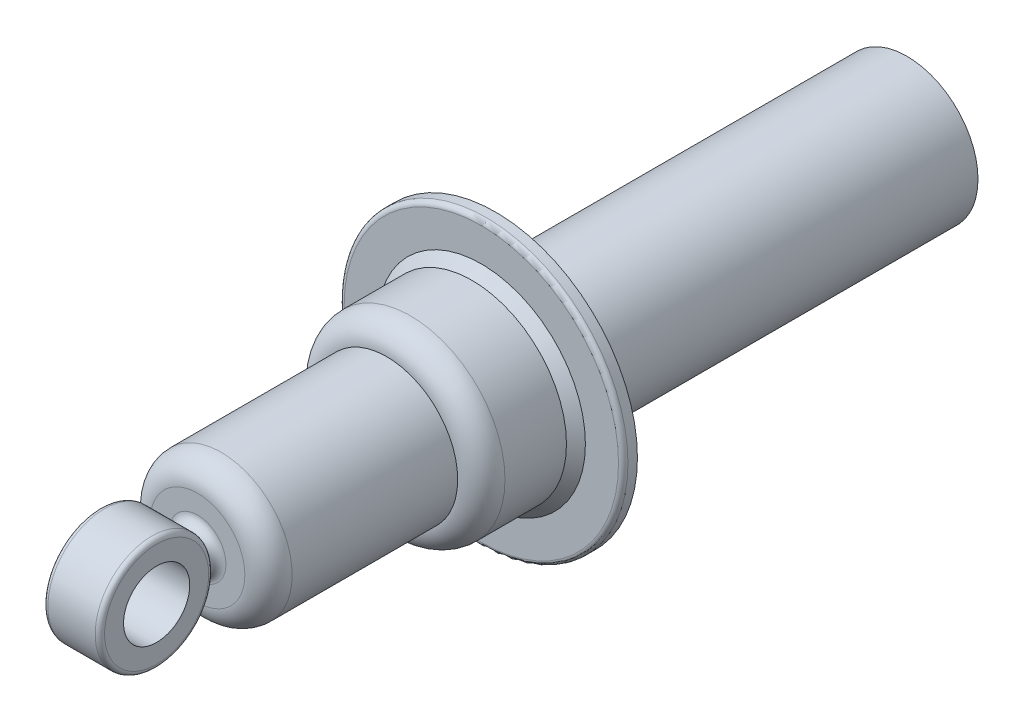
ISO-10303-21;
HEADER;
FILE_DESCRIPTION(('STEP AP214'),'2;1');
FILE_NAME('part.step','',(''),(''),'','','');
FILE_SCHEMA(('AUTOMOTIVE_DESIGN { 1 0 10303 214 1 1 1 1 }'));
ENDSEC;
DATA;
#1=APPLICATION_CONTEXT('core data for automotive mechanical design processes');
#2=APPLICATION_PROTOCOL_DEFINITION('international standard','automotive_design',2000,#1);
#3=PRODUCT_CONTEXT('',#1,'mechanical');
#4=PRODUCT('Part','Part','',(#3));
#5=PRODUCT_RELATED_PRODUCT_CATEGORY('part','',(#4));
#6=PRODUCT_DEFINITION_FORMATION('','',#4);
#7=PRODUCT_DEFINITION_CONTEXT('part definition',#1,'design');
#8=PRODUCT_DEFINITION('design','',#6,#7);
#9=PRODUCT_DEFINITION_SHAPE('','',#8);
#10=(LENGTH_UNIT() NAMED_UNIT(*) SI_UNIT(.MILLI.,.METRE.));
#11=(NAMED_UNIT(*) PLANE_ANGLE_UNIT() SI_UNIT($,.RADIAN.));
#12=(NAMED_UNIT(*) SI_UNIT($,.STERADIAN.) SOLID_ANGLE_UNIT());
#13=UNCERTAINTY_MEASURE_WITH_UNIT(LENGTH_MEASURE(1.E-05),#10,'distance_accuracy_value','');
#14=(GEOMETRIC_REPRESENTATION_CONTEXT(3) GLOBAL_UNCERTAINTY_ASSIGNED_CONTEXT((#13)) GLOBAL_UNIT_ASSIGNED_CONTEXT((#10,
#11,#12)) REPRESENTATION_CONTEXT('',''));
#15=CARTESIAN_POINT('',(0.,0.,0.));
#16=DIRECTION('',(0.,0.,1.));
#17=DIRECTION('',(1.,0.,0.));
#18=AXIS2_PLACEMENT_3D('',#15,#16,#17);
#19=CARTESIAN_POINT('',(0.,0.,65.));
#20=DIRECTION('',(0.,0.,-1.));
#21=DIRECTION('',(-1.,0.,0.));
#22=AXIS2_PLACEMENT_3D('',#19,#20,#21);
#23=TOROIDAL_SURFACE('',#22,5.99999999999999,2.);
#24=CARTESIAN_POINT('',(0.,0.,63.));
#25=DIRECTION('',(0.,0.,-1.));
#26=DIRECTION('',(-1.,0.,0.));
#27=AXIS2_PLACEMENT_3D('',#24,#25,#26);
#28=CIRCLE('',#27,5.99999999999999);
#29=CARTESIAN_POINT('',(-5.99999999999999,0.,63.));
#30=VERTEX_POINT('',#29);
#31=EDGE_CURVE('E121',#30,#30,#28,.T.);
#32=ORIENTED_EDGE('',*,*,#31,.F.);
#33=EDGE_LOOP('',(#32));
#34=FACE_BOUND('',#33,.T.);
#35=CARTESIAN_POINT('',(0.,5.14285714285714,66.8070158058105));
#36=CARTESIAN_POINT('',(-0.00683111749316836,5.14052435807147,66.805909291334));
#37=CARTESIAN_POINT('',(-0.0136583637472127,5.13818142762407,66.8047988631423));
#38=CARTESIAN_POINT('',(-0.335580244607104,5.02716482712665,66.7522261730362));
#39=CARTESIAN_POINT('',(-0.642346757596547,4.89688351274686,66.6924861731287));
#40=CARTESIAN_POINT('',(-1.23309973830504,4.59429567252348,66.562198238867));
#41=CARTESIAN_POINT('',(-1.51701026877825,4.42185616688219,66.4916163730774));
#42=CARTESIAN_POINT('',(-1.94131291127168,4.11739258260878,66.3769640915493));
#43=CARTESIAN_POINT('',(-2.09186159732641,3.99885559590663,66.3342230827088));
#44=CARTESIAN_POINT('',(-2.38136346941427,3.74821800163414,66.2487422970124));
#45=CARTESIAN_POINT('',(-2.52031365968215,3.61611390935864,66.2060025233077));
#46=CARTESIAN_POINT('',(-2.78460190632993,3.3389830329185,66.1220941042128));
#47=CARTESIAN_POINT('',(-2.90996689634401,3.19398289585244,66.0809224590997));
#48=CARTESIAN_POINT('',(-3.1454819914294,2.89137923099843,66.001606546956));
#49=CARTESIAN_POINT('',(-3.25564007915424,2.73378238481407,65.9634606960847));
#50=CARTESIAN_POINT('',(-3.42718546012719,2.45756807824615,65.9028899676523));
#51=CARTESIAN_POINT('',(-3.49310583113304,2.34201109156401,65.8792572731865));
#52=CARTESIAN_POINT('',(-3.61599679192408,2.10574311990463,65.8347005581334));
#53=CARTESIAN_POINT('',(-3.67296969680856,1.98503347845819,65.8137758371229));
#54=CARTESIAN_POINT('',(-3.77721359009538,1.73908739180227,65.7751450801437));
#55=CARTESIAN_POINT('',(-3.82449127345421,1.61385414109681,65.7574368240434));
#56=CARTESIAN_POINT('',(-3.90870796253837,1.35948901093591,65.7256793662031));
#57=CARTESIAN_POINT('',(-3.94564664839743,1.23035701099849,65.7116302776709));
#58=CARTESIAN_POINT('',(-4.00876295327995,0.968306734991215,65.68751407007));
#59=CARTESIAN_POINT('',(-4.03487629792438,0.835370716638148,65.6774707478041));
#60=CARTESIAN_POINT('',(-4.07555634614535,0.567479843073603,65.6617853992306));
#61=CARTESIAN_POINT('',(-4.09012309122624,0.432524995120603,65.6561433571024));
#62=CARTESIAN_POINT('',(-4.10742931860576,0.161768821752286,65.6494370762688));
#63=CARTESIAN_POINT('',(-4.11017101728493,0.0259676597414328,65.6483719797019));
#64=CARTESIAN_POINT('',(-4.10377818667589,-0.245306389126214,65.6508516033618));
#65=CARTESIAN_POINT('',(-4.09464442787565,-0.380779296709066,65.6543960245198));
#66=CARTESIAN_POINT('',(-4.06605733309157,-0.637867111882039,65.665449368171));
#67=CARTESIAN_POINT('',(-4.04762622916664,-0.759614424849702,65.6725652790017));
#68=CARTESIAN_POINT('',(-4.00139374245719,-1.00109431803442,65.6903284565602));
#69=CARTESIAN_POINT('',(-3.97358921197831,-1.12082620725147,65.7009769095334));
#70=CARTESIAN_POINT('',(-3.9090226888023,-1.35745605921806,65.7255431962847));
#71=CARTESIAN_POINT('',(-3.87226358280308,-1.47435492192782,65.7394599763961));
#72=CARTESIAN_POINT('',(-3.7902539750548,-1.70477418810088,65.7702527744251));
#73=CARTESIAN_POINT('',(-3.74500018414043,-1.81829326310815,65.7871299384448));
#74=CARTESIAN_POINT('',(-3.64434397228495,-2.04637324998585,65.8242937976025));
#75=CARTESIAN_POINT('',(-3.58857888275854,-2.1607547358651,65.8446990041176));
#76=CARTESIAN_POINT('',(-3.46899916652083,-2.3847763978155,65.8879086267375));
#77=CARTESIAN_POINT('',(-3.40518168474838,-2.49441487359546,65.9107138933307));
#78=CARTESIAN_POINT('',(-3.20256959341564,-2.81568020886131,65.9820622227178));
#79=CARTESIAN_POINT('',(-3.0525939488692,-3.01970462282766,66.0335458873936));
#80=CARTESIAN_POINT('',(-2.70005980014282,-3.43815477599845,66.1498048164816));
#81=CARTESIAN_POINT('',(-2.49289656376903,-3.64845457002569,66.2153519274315));
#82=CARTESIAN_POINT('',(-2.05090817454218,-4.0370429062682,66.3467059014859));
#83=CARTESIAN_POINT('',(-1.81609111881404,-4.21534078034215,66.4125126831306));
#84=CARTESIAN_POINT('',(-1.29226394743762,-4.56016048480734,66.5476001772651));
#85=CARTESIAN_POINT('',(-1.00016329566901,-4.72226416837034,66.6162498003024));
#86=CARTESIAN_POINT('',(-0.529404951856543,-4.94094752577036,66.7131948988371));
#87=CARTESIAN_POINT('',(-0.358329743011136,-5.01232606956655,66.745822226922));
#88=CARTESIAN_POINT('',(-0.130030889785519,-5.0973059289165,66.7855030702966));
#89=CARTESIAN_POINT('',(-0.0753885520475893,-5.11689340638941,66.7947179468762));
#90=CARTESIAN_POINT('',(-0.0136585437799461,-5.13818136715376,66.8047988126902));
#91=CARTESIAN_POINT('',(-0.00683129991441208,-5.14052429758992,66.8059092399263));
#92=CARTESIAN_POINT('',(0.,-5.14285714285714,66.8070158058105));
#93=B_SPLINE_CURVE_WITH_KNOTS('',3,(#35,#36,#37,#38,#39,#40,#41,#42,#43,#44,#45,#46,#47,#48,#49,
#50,#51,#52,#53,#54,#55,#56,#57,#58,#59,#60,#61,#62,#63,#64,#65,#66,#67,#68,#69,#70,#71,#72,#73,
#74,#75,#76,#77,#78,#79,#80,#81,#82,#83,#84,#85,#86,#87,#88,#89,#90,#91,#92),.UNSPECIFIED.,.F.,
.F.,(4,2,2,2,2,2,2,2,2,2,2,2,2,2,2,2,2,2,2,2,2,2,2,2,2,2,2,2,4),(0.,0.0219089296133557,
1.03365282671899,2.0486302074452,2.6368971074862,3.22531548331455,3.8125450693439,
4.39946521549095,4.80444984654547,5.20932951717326,5.61392865291026,6.01854030468785,
6.42552103130609,6.83250029502191,7.23940327488175,7.64627985590948,8.01587563708157,
8.38559565620808,8.75519664558258,9.12494104178366,9.51117946937058,9.89755522874494,
10.6701497290384,11.5740573165163,12.4777008919959,13.4968467830785,14.0609376622446,
14.2372416685142,14.2591505981276),.UNSPECIFIED.);
#94=CARTESIAN_POINT('',(0.,5.14285714285714,66.8070158058105));
#95=VERTEX_POINT('',#94);
#96=CARTESIAN_POINT('',(0.,-5.14285714285714,66.8070158058105));
#97=VERTEX_POINT('',#96);
#98=EDGE_CURVE('E64',#95,#97,#93,.T.);
#99=ORIENTED_EDGE('',*,*,#98,.F.);
#100=CARTESIAN_POINT('',(0.,-5.14285714285714,66.8070158058105));
#101=CARTESIAN_POINT('',(0.00683111749316836,-5.14052435807147,66.805909291334));
#102=CARTESIAN_POINT('',(0.0136583637472127,-5.13818142762407,66.8047988631423));
#103=CARTESIAN_POINT('',(0.335580244607104,-5.02716482712665,66.7522261730362));
#104=CARTESIAN_POINT('',(0.642346757596547,-4.89688351274686,66.6924861731287));
#105=CARTESIAN_POINT('',(1.23309973830504,-4.59429567252348,66.562198238867));
#106=CARTESIAN_POINT('',(1.51701026877825,-4.42185616688219,66.4916163730774));
#107=CARTESIAN_POINT('',(1.94131291127168,-4.11739258260878,66.3769640915493));
#108=CARTESIAN_POINT('',(2.09186159732641,-3.99885559590663,66.3342230827088));
#109=CARTESIAN_POINT('',(2.38136346941427,-3.74821800163414,66.2487422970124));
#110=CARTESIAN_POINT('',(2.52031365968215,-3.61611390935864,66.2060025233077));
#111=CARTESIAN_POINT('',(2.78460190632993,-3.3389830329185,66.1220941042128));
#112=CARTESIAN_POINT('',(2.90996689634401,-3.19398289585244,66.0809224590997));
#113=CARTESIAN_POINT('',(3.1454819914294,-2.89137923099843,66.001606546956));
#114=CARTESIAN_POINT('',(3.25564007915424,-2.73378238481407,65.9634606960847));
#115=CARTESIAN_POINT('',(3.42718546012719,-2.45756807824615,65.9028899676523));
#116=CARTESIAN_POINT('',(3.49310583113304,-2.34201109156401,65.8792572731865));
#117=CARTESIAN_POINT('',(3.61599679192408,-2.10574311990463,65.8347005581334));
#118=CARTESIAN_POINT('',(3.67296969680856,-1.98503347845819,65.8137758371229));
#119=CARTESIAN_POINT('',(3.77721359009538,-1.73908739180227,65.7751450801437));
#120=CARTESIAN_POINT('',(3.82449127345421,-1.61385414109681,65.7574368240434));
#121=CARTESIAN_POINT('',(3.90870796253837,-1.35948901093591,65.7256793662031));
#122=CARTESIAN_POINT('',(3.94564664839743,-1.23035701099849,65.7116302776709));
#123=CARTESIAN_POINT('',(4.00876295327995,-0.968306734991215,65.68751407007));
#124=CARTESIAN_POINT('',(4.03487629792438,-0.835370716638148,65.6774707478041));
#125=CARTESIAN_POINT('',(4.07555634614535,-0.567479843073603,65.6617853992306));
#126=CARTESIAN_POINT('',(4.09012309122624,-0.432524995120603,65.6561433571024));
#127=CARTESIAN_POINT('',(4.10742931860576,-0.161768821752286,65.6494370762688));
#128=CARTESIAN_POINT('',(4.11017101728493,-0.0259676597414328,65.6483719797019));
#129=CARTESIAN_POINT('',(4.10377818667589,0.245306389126214,65.6508516033618));
#130=CARTESIAN_POINT('',(4.09464442787565,0.380779296709066,65.6543960245198));
#131=CARTESIAN_POINT('',(4.06605733309157,0.637867111882039,65.665449368171));
#132=CARTESIAN_POINT('',(4.04762622916664,0.759614424849702,65.6725652790017));
#133=CARTESIAN_POINT('',(4.00139374245719,1.00109431803442,65.6903284565602));
#134=CARTESIAN_POINT('',(3.97358921197831,1.12082620725147,65.7009769095334));
#135=CARTESIAN_POINT('',(3.9090226888023,1.35745605921806,65.7255431962847));
#136=CARTESIAN_POINT('',(3.87226358280308,1.47435492192782,65.7394599763961));
#137=CARTESIAN_POINT('',(3.7902539750548,1.70477418810088,65.7702527744251));
#138=CARTESIAN_POINT('',(3.74500018414043,1.81829326310815,65.7871299384448));
#139=CARTESIAN_POINT('',(3.64434397228495,2.04637324998585,65.8242937976025));
#140=CARTESIAN_POINT('',(3.58857888275854,2.1607547358651,65.8446990041176));
#141=CARTESIAN_POINT('',(3.46899916652083,2.3847763978155,65.8879086267375));
#142=CARTESIAN_POINT('',(3.40518168474838,2.49441487359546,65.9107138933307));
#143=CARTESIAN_POINT('',(3.20256959341564,2.81568020886131,65.9820622227178));
#144=CARTESIAN_POINT('',(3.0525939488692,3.01970462282766,66.0335458873936));
#145=CARTESIAN_POINT('',(2.70005980014282,3.43815477599845,66.1498048164816));
#146=CARTESIAN_POINT('',(2.49289656376903,3.64845457002569,66.2153519274315));
#147=CARTESIAN_POINT('',(2.05090817454218,4.0370429062682,66.3467059014859));
#148=CARTESIAN_POINT('',(1.81609111881404,4.21534078034215,66.4125126831306));
#149=CARTESIAN_POINT('',(1.29226394743762,4.56016048480734,66.5476001772651));
#150=CARTESIAN_POINT('',(1.00016329566901,4.72226416837034,66.6162498003024));
#151=CARTESIAN_POINT('',(0.529404951856543,4.94094752577036,66.7131948988371));
#152=CARTESIAN_POINT('',(0.358329743011136,5.01232606956655,66.745822226922));
#153=CARTESIAN_POINT('',(0.130030889785519,5.0973059289165,66.7855030702966));
#154=CARTESIAN_POINT('',(0.0753885520475893,5.11689340638941,66.7947179468762));
#155=CARTESIAN_POINT('',(0.0136585437799461,5.13818136715376,66.8047988126902));
#156=CARTESIAN_POINT('',(0.00683129991441208,5.14052429758992,66.8059092399263));
#157=CARTESIAN_POINT('',(0.,5.14285714285714,66.8070158058105));
#158=B_SPLINE_CURVE_WITH_KNOTS('',3,(#100,#101,#102,#103,#104,#105,#106,#107,#108,#109,#110,
#111,#112,#113,#114,#115,#116,#117,#118,#119,#120,#121,#122,#123,#124,#125,#126,#127,#128,#129,
#130,#131,#132,#133,#134,#135,#136,#137,#138,#139,#140,#141,#142,#143,#144,#145,#146,#147,#148,
#149,#150,#151,#152,#153,#154,#155,#156,#157),.UNSPECIFIED.,.F.,.F.,(4,2,2,2,2,2,2,2,2,2,2,2,2,
2,2,2,2,2,2,2,2,2,2,2,2,2,2,2,4),(0.,0.0219089296133557,1.03365282671899,2.0486302074452,
2.6368971074862,3.22531548331455,3.8125450693439,4.39946521549095,4.80444984654547,
5.20932951717326,5.61392865291026,6.01854030468785,6.42552103130609,6.83250029502191,
7.23940327488175,7.64627985590948,8.01587563708157,8.38559565620808,8.75519664558258,
9.12494104178366,9.51117946937058,9.89755522874494,10.6701497290384,11.5740573165163,
12.4777008919959,13.4968467830785,14.0609376622446,14.2372416685142,14.2591505981276),.UNSPECIFIED.);
#159=EDGE_CURVE('E61',#97,#95,#158,.T.);
#160=ORIENTED_EDGE('',*,*,#159,.F.);
#161=EDGE_LOOP('',(#99,#160));
#162=FACE_BOUND('',#161,.T.);
#163=ADVANCED_FACE('F47',(#34,#162),#23,.F.);
#164=CARTESIAN_POINT('',(0.,0.,3.));
#165=DIRECTION('',(0.,0.,-1.));
#166=DIRECTION('',(-1.,0.,0.));
#167=AXIS2_PLACEMENT_3D('',#164,#165,#166);
#168=PLANE('',#167);
#169=CARTESIAN_POINT('',(0.,0.,3.));
#170=DIRECTION('',(0.,0.,1.));
#171=DIRECTION('',(1.,0.,0.));
#172=AXIS2_PLACEMENT_3D('',#169,#170,#171);
#173=CIRCLE('',#172,7.50000000000002);
#174=CARTESIAN_POINT('',(7.50000000000002,0.,3.));
#175=VERTEX_POINT('',#174);
#176=EDGE_CURVE('E150',#175,#175,#173,.T.);
#177=ORIENTED_EDGE('',*,*,#176,.F.);
#178=EDGE_LOOP('',(#177));
#179=FACE_BOUND('',#178,.T.);
#180=ADVANCED_FACE('F109',(#179),#168,.T.);
#181=CARTESIAN_POINT('',(0.,0.,71.7954339583367));
#182=DIRECTION('',(0.,0.,1.));
#183=DIRECTION('',(1.,0.,0.));
#184=AXIS2_PLACEMENT_3D('',#181,#182,#183);
#185=CYLINDRICAL_SURFACE('',#184,7.50000000000002);
#186=CARTESIAN_POINT('',(0.,0.,-86.));
#187=DIRECTION('',(0.,0.,-1.));
#188=DIRECTION('',(-1.,0.,0.));
#189=AXIS2_PLACEMENT_3D('',#186,#187,#188);
#190=CIRCLE('',#189,7.50000000000002);
#191=CARTESIAN_POINT('',(-7.50000000000002,0.,-86.));
#192=VERTEX_POINT('',#191);
#193=EDGE_CURVE('E153',#192,#192,#190,.T.);
#194=ORIENTED_EDGE('',*,*,#193,.T.);
#195=EDGE_LOOP('',(#194));
#196=FACE_BOUND('',#195,.T.);
#197=ORIENTED_EDGE('',*,*,#176,.T.);
#198=EDGE_LOOP('',(#197));
#199=FACE_BOUND('',#198,.T.);
#200=ADVANCED_FACE('F118',(#196,#199),#185,.F.);
#201=CARTESIAN_POINT('',(0.,0.,-87.));
#202=DIRECTION('',(0.,0.,-1.));
#203=DIRECTION('',(-1.,0.,0.));
#204=AXIS2_PLACEMENT_3D('',#201,#202,#203);
#205=PLANE('',#204);
#206=CARTESIAN_POINT('',(0.,0.,-87.));
#207=DIRECTION('',(0.,0.,-1.));
#208=DIRECTION('',(-1.,0.,0.));
#209=AXIS2_PLACEMENT_3D('',#206,#207,#208);
#210=CIRCLE('',#209,8.50000000000002);
#211=CARTESIAN_POINT('',(-8.50000000000002,0.,-87.));
#212=VERTEX_POINT('',#211);
#213=EDGE_CURVE('E147',#212,#212,#210,.F.);
#214=ORIENTED_EDGE('',*,*,#213,.T.);
#215=EDGE_LOOP('',(#214));
#216=FACE_BOUND('',#215,.T.);
#217=CARTESIAN_POINT('',(0.,0.,-87.));
#218=DIRECTION('',(0.,0.,1.));
#219=DIRECTION('',(1.,0.,0.));
#220=AXIS2_PLACEMENT_3D('',#217,#218,#219);
#221=CIRCLE('',#220,15.);
#222=CARTESIAN_POINT('',(15.,0.,-87.));
#223=VERTEX_POINT('',#222);
#224=EDGE_CURVE('E145',#223,#223,#221,.T.);
#225=ORIENTED_EDGE('',*,*,#224,.F.);
#226=EDGE_LOOP('',(#225));
#227=FACE_BOUND('',#226,.T.);
#228=ADVANCED_FACE('F336',(#216,#227),#205,.T.);
#229=CARTESIAN_POINT('',(0.,0.,71.7954339583367));
#230=DIRECTION('',(0.,0.,1.));
#231=DIRECTION('',(1.,0.,0.));
#232=AXIS2_PLACEMENT_3D('',#229,#230,#231);
#233=CYLINDRICAL_SURFACE('',#232,15.);
#234=ORIENTED_EDGE('',*,*,#224,.T.);
#235=EDGE_LOOP('',(#234));
#236=FACE_BOUND('',#235,.T.);
#237=CARTESIAN_POINT('',(0.,0.,-3.));
#238=DIRECTION('',(0.,0.,1.));
#239=DIRECTION('',(1.,0.,0.));
#240=AXIS2_PLACEMENT_3D('',#237,#238,#239);
#241=CIRCLE('',#240,15.);
#242=CARTESIAN_POINT('',(15.,0.,-3.));
#243=VERTEX_POINT('',#242);
#244=EDGE_CURVE('E143',#243,#243,#241,.T.);
#245=ORIENTED_EDGE('',*,*,#244,.F.);
#246=EDGE_LOOP('',(#245));
#247=FACE_BOUND('',#246,.T.);
#248=ADVANCED_FACE('F350',(#236,#247),#233,.T.);
#249=CARTESIAN_POINT('',(0.,0.,-3.));
#250=DIRECTION('',(0.,0.,-1.));
#251=DIRECTION('',(-1.,0.,0.));
#252=AXIS2_PLACEMENT_3D('',#249,#250,#251);
#253=PLANE('',#252);
#254=ORIENTED_EDGE('',*,*,#244,.T.);
#255=EDGE_LOOP('',(#254));
#256=FACE_BOUND('',#255,.T.);
#257=CARTESIAN_POINT('',(0.,0.,-3.));
#258=DIRECTION('',(0.,0.,1.));
#259=DIRECTION('',(1.,0.,0.));
#260=AXIS2_PLACEMENT_3D('',#257,#258,#259);
#261=CIRCLE('',#260,20.);
#262=CARTESIAN_POINT('',(20.,0.,-3.));
#263=VERTEX_POINT('',#262);
#264=EDGE_CURVE('E139',#263,#263,#261,.T.);
#265=ORIENTED_EDGE('',*,*,#264,.F.);
#266=EDGE_LOOP('',(#265));
#267=FACE_BOUND('',#266,.T.);
#268=ADVANCED_FACE('F360',(#256,#267),#253,.T.);
#269=CARTESIAN_POINT('',(0.,0.,71.7954339583367));
#270=DIRECTION('',(0.,0.,1.));
#271=DIRECTION('',(1.,0.,0.));
#272=AXIS2_PLACEMENT_3D('',#269,#270,#271);
#273=CYLINDRICAL_SURFACE('',#272,20.);
#274=CARTESIAN_POINT('',(0.,0.,0.));
#275=DIRECTION('',(0.,0.,1.));
#276=DIRECTION('',(1.,0.,0.));
#277=AXIS2_PLACEMENT_3D('',#274,#275,#276);
#278=CIRCLE('',#277,20.);
#279=CARTESIAN_POINT('',(20.,0.,0.));
#280=VERTEX_POINT('',#279);
#281=EDGE_CURVE('E134',#280,#280,#278,.T.);
#282=ORIENTED_EDGE('',*,*,#281,.F.);
#283=EDGE_LOOP('',(#282));
#284=FACE_BOUND('',#283,.T.);
#285=ORIENTED_EDGE('',*,*,#264,.T.);
#286=EDGE_LOOP('',(#285));
#287=FACE_BOUND('',#286,.T.);
#288=ADVANCED_FACE('F324',(#284,#287),#273,.T.);
#289=CARTESIAN_POINT('',(0.,0.,0.));
#290=DIRECTION('',(0.,0.,-1.));
#291=DIRECTION('',(-1.,0.,0.));
#292=AXIS2_PLACEMENT_3D('',#289,#290,#291);
#293=PLANE('',#292);
#294=ORIENTED_EDGE('',*,*,#281,.T.);
#295=EDGE_LOOP('',(#294));
#296=FACE_BOUND('',#295,.T.);
#297=CARTESIAN_POINT('',(0.,0.,0.));
#298=DIRECTION('',(0.,0.,1.));
#299=DIRECTION('',(1.,0.,0.));
#300=AXIS2_PLACEMENT_3D('',#297,#298,#299);
#301=CIRCLE('',#300,30.);
#302=CARTESIAN_POINT('',(30.,0.,0.));
#303=VERTEX_POINT('',#302);
#304=EDGE_CURVE('E130',#303,#303,#301,.T.);
#305=ORIENTED_EDGE('',*,*,#304,.F.);
#306=EDGE_LOOP('',(#305));
#307=FACE_BOUND('',#306,.T.);
#308=ADVANCED_FACE('F312',(#296,#307),#293,.T.);
#309=CARTESIAN_POINT('',(0.,0.,71.7954339583367));
#310=DIRECTION('',(0.,0.,1.));
#311=DIRECTION('',(1.,0.,0.));
#312=AXIS2_PLACEMENT_3D('',#309,#310,#311);
#313=CYLINDRICAL_SURFACE('',#312,30.);
#314=CARTESIAN_POINT('',(0.,0.,2.));
#315=DIRECTION('',(0.,0.,1.));
#316=DIRECTION('',(1.,0.,0.));
#317=AXIS2_PLACEMENT_3D('',#314,#315,#316);
#318=CIRCLE('',#317,30.);
#319=CARTESIAN_POINT('',(30.,0.,2.));
#320=VERTEX_POINT('',#319);
#321=EDGE_CURVE('E169',#320,#320,#318,.F.);
#322=ORIENTED_EDGE('',*,*,#321,.T.);
#323=EDGE_LOOP('',(#322));
#324=FACE_BOUND('',#323,.T.);
#325=ORIENTED_EDGE('',*,*,#304,.T.);
#326=EDGE_LOOP('',(#325));
#327=FACE_BOUND('',#326,.T.);
#328=ADVANCED_FACE('F308',(#324,#327),#313,.T.);
#329=CARTESIAN_POINT('',(0.,0.,3.00000000000001));
#330=DIRECTION('',(0.,0.,1.));
#331=DIRECTION('',(1.,0.,0.));
#332=AXIS2_PLACEMENT_3D('',#329,#330,#331);
#333=PLANE('',#332);
#334=CARTESIAN_POINT('',(0.,0.,3.00000000000001));
#335=DIRECTION('',(0.,0.,1.));
#336=DIRECTION('',(1.,0.,0.));
#337=AXIS2_PLACEMENT_3D('',#334,#335,#336);
#338=CIRCLE('',#337,22.);
#339=CARTESIAN_POINT('',(22.,0.,3.00000000000001));
#340=VERTEX_POINT('',#339);
#341=EDGE_CURVE('E70',#340,#340,#338,.F.);
#342=ORIENTED_EDGE('',*,*,#341,.T.);
#343=EDGE_LOOP('',(#342));
#344=FACE_BOUND('',#343,.T.);
#345=CARTESIAN_POINT('',(0.,0.,3.00000000000001));
#346=DIRECTION('',(0.,0.,1.));
#347=DIRECTION('',(1.,0.,0.));
#348=AXIS2_PLACEMENT_3D('',#345,#346,#347);
#349=CIRCLE('',#348,29.);
#350=CARTESIAN_POINT('',(29.,0.,3.00000000000001));
#351=VERTEX_POINT('',#350);
#352=EDGE_CURVE('E164',#351,#351,#349,.T.);
#353=ORIENTED_EDGE('',*,*,#352,.T.);
#354=EDGE_LOOP('',(#353));
#355=FACE_BOUND('',#354,.T.);
#356=ADVANCED_FACE('F296',(#344,#355),#333,.T.);
#357=CARTESIAN_POINT('',(0.,0.,71.7954339583367));
#358=DIRECTION('',(0.,0.,1.));
#359=DIRECTION('',(1.,0.,0.));
#360=AXIS2_PLACEMENT_3D('',#357,#358,#359);
#361=CYLINDRICAL_SURFACE('',#360,20.);
#362=CARTESIAN_POINT('',(0.,0.,5.));
#363=DIRECTION('',(0.,0.,1.));
#364=DIRECTION('',(1.,0.,0.));
#365=AXIS2_PLACEMENT_3D('',#362,#363,#364);
#366=CIRCLE('',#365,20.);
#367=CARTESIAN_POINT('',(20.,0.,5.));
#368=VERTEX_POINT('',#367);
#369=EDGE_CURVE('E71',#368,#368,#366,.T.);
#370=ORIENTED_EDGE('',*,*,#369,.T.);
#371=EDGE_LOOP('',(#370));
#372=FACE_BOUND('',#371,.T.);
#373=CARTESIAN_POINT('',(0.,0.,18.));
#374=DIRECTION('',(0.,0.,1.));
#375=DIRECTION('',(1.,0.,0.));
#376=AXIS2_PLACEMENT_3D('',#373,#374,#375);
#377=CIRCLE('',#376,20.);
#378=CARTESIAN_POINT('',(20.,0.,18.));
#379=VERTEX_POINT('',#378);
#380=EDGE_CURVE('E165',#379,#379,#377,.F.);
#381=ORIENTED_EDGE('',*,*,#380,.T.);
#382=EDGE_LOOP('',(#381));
#383=FACE_BOUND('',#382,.T.);
#384=ADVANCED_FACE('F171',(#372,#383),#361,.T.);
#385=CARTESIAN_POINT('',(0.,0.,71.7954339583367));
#386=DIRECTION('',(0.,0.,1.));
#387=DIRECTION('',(1.,0.,0.));
#388=AXIS2_PLACEMENT_3D('',#385,#386,#387);
#389=CYLINDRICAL_SURFACE('',#388,15.);
#390=CARTESIAN_POINT('',(0.,0.,58.));
#391=DIRECTION('',(0.,0.,1.));
#392=DIRECTION('',(1.,0.,0.));
#393=AXIS2_PLACEMENT_3D('',#390,#391,#392);
#394=CIRCLE('',#393,15.);
#395=CARTESIAN_POINT('',(15.,0.,58.));
#396=VERTEX_POINT('',#395);
#397=EDGE_CURVE('E157',#396,#396,#394,.F.);
#398=ORIENTED_EDGE('',*,*,#397,.T.);
#399=EDGE_LOOP('',(#398));
#400=FACE_BOUND('',#399,.T.);
#401=CARTESIAN_POINT('',(0.,0.,23.));
#402=DIRECTION('',(0.,0.,1.));
#403=DIRECTION('',(1.,0.,0.));
#404=AXIS2_PLACEMENT_3D('',#401,#402,#403);
#405=CIRCLE('',#404,15.);
#406=CARTESIAN_POINT('',(15.,0.,23.));
#407=VERTEX_POINT('',#406);
#408=EDGE_CURVE('E124',#407,#407,#405,.T.);
#409=ORIENTED_EDGE('',*,*,#408,.T.);
#410=EDGE_LOOP('',(#409));
#411=FACE_BOUND('',#410,.T.);
#412=ADVANCED_FACE('F281',(#400,#411),#389,.T.);
#413=CARTESIAN_POINT('',(0.,0.,63.));
#414=DIRECTION('',(0.,0.,1.));
#415=DIRECTION('',(1.,0.,0.));
#416=AXIS2_PLACEMENT_3D('',#413,#414,#415);
#417=PLANE('',#416);
#418=ORIENTED_EDGE('',*,*,#31,.T.);
#419=EDGE_LOOP('',(#418));
#420=FACE_BOUND('',#419,.T.);
#421=CARTESIAN_POINT('',(0.,0.,63.));
#422=DIRECTION('',(0.,0.,1.));
#423=DIRECTION('',(1.,0.,0.));
#424=AXIS2_PLACEMENT_3D('',#421,#422,#423);
#425=CIRCLE('',#424,10.);
#426=CARTESIAN_POINT('',(10.,0.,63.));
#427=VERTEX_POINT('',#426);
#428=EDGE_CURVE('E156',#427,#427,#425,.T.);
#429=ORIENTED_EDGE('',*,*,#428,.T.);
#430=EDGE_LOOP('',(#429));
#431=FACE_BOUND('',#430,.T.);
#432=ADVANCED_FACE('F272',(#420,#431),#417,.T.);
#433=CARTESIAN_POINT('',(0.,0.,-86.));
#434=DIRECTION('',(0.,0.,-1.));
#435=DIRECTION('',(-1.,0.,0.));
#436=AXIS2_PLACEMENT_3D('',#433,#434,#435);
#437=TOROIDAL_SURFACE('',#436,8.50000000000002,1.);
#438=ORIENTED_EDGE('',*,*,#193,.F.);
#439=EDGE_LOOP('',(#438));
#440=FACE_BOUND('',#439,.T.);
#441=ORIENTED_EDGE('',*,*,#213,.F.);
#442=EDGE_LOOP('',(#441));
#443=FACE_BOUND('',#442,.T.);
#444=ADVANCED_FACE('F265',(#440,#443),#437,.T.);
#445=CARTESIAN_POINT('',(0.,0.,58.));
#446=DIRECTION('',(0.,0.,1.));
#447=DIRECTION('',(1.,0.,0.));
#448=AXIS2_PLACEMENT_3D('',#445,#446,#447);
#449=TOROIDAL_SURFACE('',#448,10.,5.);
#450=ORIENTED_EDGE('',*,*,#397,.F.);
#451=EDGE_LOOP('',(#450));
#452=FACE_BOUND('',#451,.T.);
#453=ORIENTED_EDGE('',*,*,#428,.F.);
#454=EDGE_LOOP('',(#453));
#455=FACE_BOUND('',#454,.T.);
#456=ADVANCED_FACE('F251',(#452,#455),#449,.T.);
#457=CARTESIAN_POINT('',(0.,0.,18.));
#458=DIRECTION('',(0.,0.,1.));
#459=DIRECTION('',(1.,0.,0.));
#460=AXIS2_PLACEMENT_3D('',#457,#458,#459);
#461=TOROIDAL_SURFACE('',#460,15.,5.);
#462=ORIENTED_EDGE('',*,*,#380,.F.);
#463=EDGE_LOOP('',(#462));
#464=FACE_BOUND('',#463,.T.);
#465=ORIENTED_EDGE('',*,*,#408,.F.);
#466=EDGE_LOOP('',(#465));
#467=FACE_BOUND('',#466,.T.);
#468=ADVANCED_FACE('F181',(#464,#467),#461,.T.);
#469=CARTESIAN_POINT('',(0.,0.,2.));
#470=DIRECTION('',(0.,0.,1.));
#471=DIRECTION('',(1.,0.,0.));
#472=AXIS2_PLACEMENT_3D('',#469,#470,#471);
#473=TOROIDAL_SURFACE('',#472,29.,1.);
#474=ORIENTED_EDGE('',*,*,#321,.F.);
#475=EDGE_LOOP('',(#474));
#476=FACE_BOUND('',#475,.T.);
#477=ORIENTED_EDGE('',*,*,#352,.F.);
#478=EDGE_LOOP('',(#477));
#479=FACE_BOUND('',#478,.T.);
#480=ADVANCED_FACE('F176',(#476,#479),#473,.T.);
#481=CARTESIAN_POINT('',(0.,0.,5.));
#482=DIRECTION('',(0.,0.,-1.));
#483=DIRECTION('',(-1.,0.,0.));
#484=AXIS2_PLACEMENT_3D('',#481,#482,#483);
#485=CONICAL_SURFACE('',#484,20.,0.785398163397441);
#486=ORIENTED_EDGE('',*,*,#341,.F.);
#487=EDGE_LOOP('',(#486));
#488=FACE_BOUND('',#487,.T.);
#489=ORIENTED_EDGE('',*,*,#369,.F.);
#490=EDGE_LOOP('',(#489));
#491=FACE_BOUND('',#490,.T.);
#492=ADVANCED_FACE('F94',(#488,#491),#485,.T.);
#493=CARTESIAN_POINT('',(6.,0.,77.6491106406735));
#494=DIRECTION('',(-1.,0.,0.));
#495=DIRECTION('',(0.,0.,1.));
#496=AXIS2_PLACEMENT_3D('',#493,#494,#495);
#497=CYLINDRICAL_SURFACE('',#496,12.);
#498=CARTESIAN_POINT('',(-5.,0.,77.6491106406735));
#499=DIRECTION('',(1.,0.,0.));
#500=DIRECTION('',(0.,0.,-1.));
#501=AXIS2_PLACEMENT_3D('',#498,#499,#500);
#502=CIRCLE('',#501,12.);
#503=CARTESIAN_POINT('',(-5.,0.,65.6491106406735));
#504=VERTEX_POINT('',#503);
#505=EDGE_CURVE('E202',#504,#504,#502,.T.);
#506=ORIENTED_EDGE('',*,*,#505,.T.);
#507=EDGE_LOOP('',(#506));
#508=FACE_BOUND('',#507,.T.);
#509=CARTESIAN_POINT('',(5.,0.,77.6491106406735));
#510=DIRECTION('',(1.,0.,0.));
#511=DIRECTION('',(0.,0.,-1.));
#512=AXIS2_PLACEMENT_3D('',#509,#510,#511);
#513=CIRCLE('',#512,12.);
#514=CARTESIAN_POINT('',(5.,0.,65.6491106406735));
#515=VERTEX_POINT('',#514);
#516=EDGE_CURVE('E67',#515,#515,#513,.F.);
#517=ORIENTED_EDGE('',*,*,#516,.T.);
#518=EDGE_LOOP('',(#517));
#519=FACE_BOUND('',#518,.T.);
#520=ORIENTED_EDGE('',*,*,#159,.T.);
#521=ORIENTED_EDGE('',*,*,#98,.T.);
#522=EDGE_LOOP('',(#520,#521));
#523=FACE_BOUND('',#522,.T.);
#524=ADVANCED_FACE('F68',(#508,#519,#523),#497,.T.);
#525=CARTESIAN_POINT('',(6.,0.,77.6491106406735));
#526=DIRECTION('',(-1.,0.,0.));
#527=DIRECTION('',(0.,0.,1.));
#528=AXIS2_PLACEMENT_3D('',#525,#526,#527);
#529=CYLINDRICAL_SURFACE('',#528,7.00000000000001);
#530=CARTESIAN_POINT('',(6.,0.,77.6491106406735));
#531=DIRECTION('',(1.,0.,0.));
#532=DIRECTION('',(0.,0.,-1.));
#533=AXIS2_PLACEMENT_3D('',#530,#531,#532);
#534=CIRCLE('',#533,7.00000000000001);
#535=CARTESIAN_POINT('',(6.,0.,70.6491106406735));
#536=VERTEX_POINT('',#535);
#537=EDGE_CURVE('E123',#536,#536,#534,.T.);
#538=ORIENTED_EDGE('',*,*,#537,.T.);
#539=EDGE_LOOP('',(#538));
#540=FACE_BOUND('',#539,.T.);
#541=CARTESIAN_POINT('',(-6.,0.,77.6491106406735));
#542=DIRECTION('',(1.,0.,0.));
#543=DIRECTION('',(0.,0.,-1.));
#544=AXIS2_PLACEMENT_3D('',#541,#542,#543);
#545=CIRCLE('',#544,7.00000000000001);
#546=CARTESIAN_POINT('',(-6.,0.,70.6491106406735));
#547=VERTEX_POINT('',#546);
#548=EDGE_CURVE('E129',#547,#547,#545,.T.);
#549=ORIENTED_EDGE('',*,*,#548,.F.);
#550=EDGE_LOOP('',(#549));
#551=FACE_BOUND('',#550,.T.);
#552=ADVANCED_FACE('F91',(#540,#551),#529,.F.);
#553=CARTESIAN_POINT('',(6.,0.,0.));
#554=DIRECTION('',(1.,0.,0.));
#555=DIRECTION('',(0.,0.,-1.));
#556=AXIS2_PLACEMENT_3D('',#553,#554,#555);
#557=PLANE('',#556);
#558=CARTESIAN_POINT('',(6.,0.,77.6491106406735));
#559=DIRECTION('',(1.,0.,0.));
#560=DIRECTION('',(0.,0.,-1.));
#561=AXIS2_PLACEMENT_3D('',#558,#559,#560);
#562=CIRCLE('',#561,11.);
#563=CARTESIAN_POINT('',(6.,0.,66.6491106406735));
#564=VERTEX_POINT('',#563);
#565=EDGE_CURVE('E11',#564,#564,#562,.T.);
#566=ORIENTED_EDGE('',*,*,#565,.T.);
#567=EDGE_LOOP('',(#566));
#568=FACE_BOUND('',#567,.T.);
#569=ORIENTED_EDGE('',*,*,#537,.F.);
#570=EDGE_LOOP('',(#569));
#571=FACE_BOUND('',#570,.T.);
#572=ADVANCED_FACE('F99',(#568,#571),#557,.T.);
#573=CARTESIAN_POINT('',(-6.,0.,0.));
#574=DIRECTION('',(1.,0.,0.));
#575=DIRECTION('',(0.,0.,-1.));
#576=AXIS2_PLACEMENT_3D('',#573,#574,#575);
#577=PLANE('',#576);
#578=CARTESIAN_POINT('',(-6.,0.,77.6491106406735));
#579=DIRECTION('',(1.,0.,0.));
#580=DIRECTION('',(0.,0.,-1.));
#581=AXIS2_PLACEMENT_3D('',#578,#579,#580);
#582=CIRCLE('',#581,11.);
#583=CARTESIAN_POINT('',(-6.,0.,66.6491106406735));
#584=VERTEX_POINT('',#583);
#585=EDGE_CURVE('E60',#584,#584,#582,.F.);
#586=ORIENTED_EDGE('',*,*,#585,.T.);
#587=EDGE_LOOP('',(#586));
#588=FACE_BOUND('',#587,.T.);
#589=ORIENTED_EDGE('',*,*,#548,.T.);
#590=EDGE_LOOP('',(#589));
#591=FACE_BOUND('',#590,.T.);
#592=ADVANCED_FACE('F96',(#588,#591),#577,.F.);
#593=CARTESIAN_POINT('',(-5.,0.,77.6491106406735));
#594=DIRECTION('',(1.,0.,0.));
#595=DIRECTION('',(0.,0.,-1.));
#596=AXIS2_PLACEMENT_3D('',#593,#594,#595);
#597=TOROIDAL_SURFACE('',#596,11.,1.);
#598=ORIENTED_EDGE('',*,*,#585,.F.);
#599=EDGE_LOOP('',(#598));
#600=FACE_BOUND('',#599,.T.);
#601=ORIENTED_EDGE('',*,*,#505,.F.);
#602=EDGE_LOOP('',(#601));
#603=FACE_BOUND('',#602,.T.);
#604=ADVANCED_FACE('F191',(#600,#603),#597,.T.);
#605=CARTESIAN_POINT('',(5.,0.,77.6491106406735));
#606=DIRECTION('',(1.,0.,0.));
#607=DIRECTION('',(0.,0.,-1.));
#608=AXIS2_PLACEMENT_3D('',#605,#606,#607);
#609=TOROIDAL_SURFACE('',#608,11.,1.);
#610=ORIENTED_EDGE('',*,*,#516,.F.);
#611=EDGE_LOOP('',(#610));
#612=FACE_BOUND('',#611,.T.);
#613=ORIENTED_EDGE('',*,*,#565,.F.);
#614=EDGE_LOOP('',(#613));
#615=FACE_BOUND('',#614,.T.);
#616=ADVANCED_FACE('F51',(#612,#615),#609,.T.);
#617=CLOSED_SHELL('',(#163,#180,#200,#228,#248,#268,#288,#308,#328,#356,#384,#412,#432,#444,
#456,#468,#480,#492,#524,#552,#572,#592,#604,#616));
#618=MANIFOLD_SOLID_BREP('B2',#617);
#619=ADVANCED_BREP_SHAPE_REPRESENTATION('',(#18,#618),#14);
#620=SHAPE_DEFINITION_REPRESENTATION(#9,#619);
ENDSEC;
END-ISO-10303-21;
